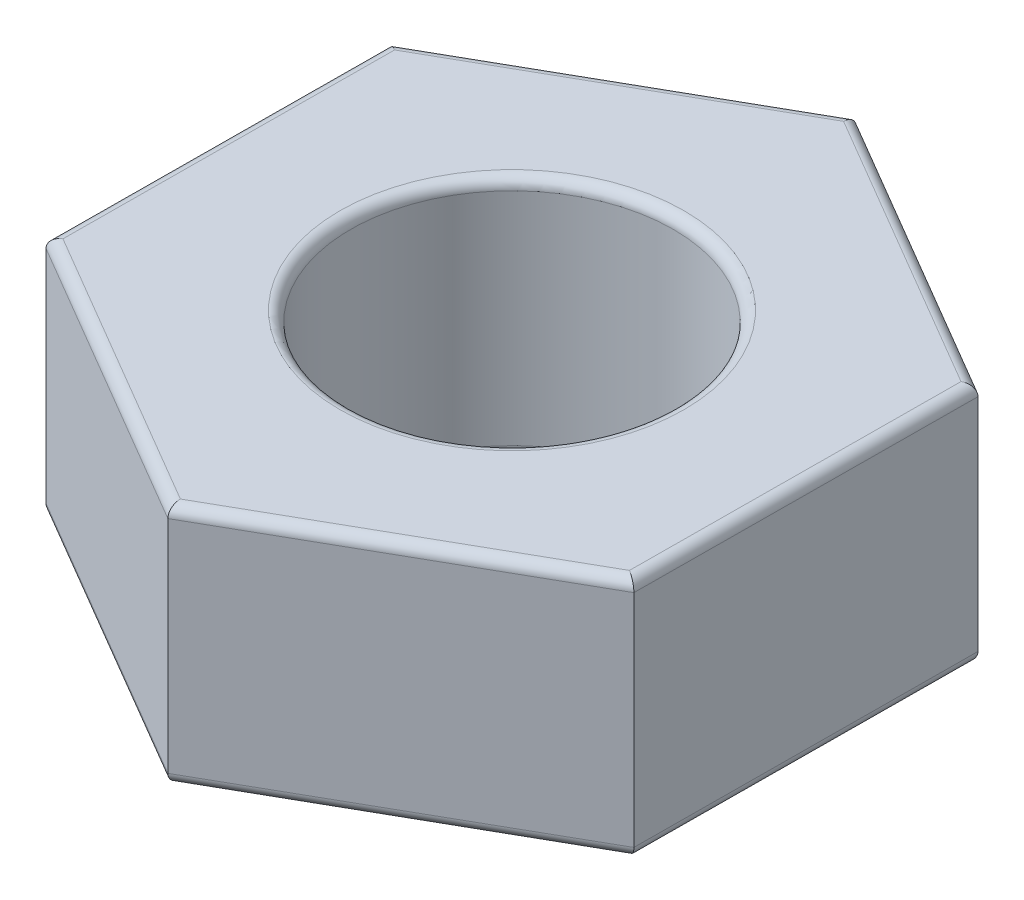
ISO-10303-21;
HEADER;
FILE_DESCRIPTION(('STEP AP214'),'2;1');
FILE_NAME('part.step','',(''),(''),'','','');
FILE_SCHEMA(('AUTOMOTIVE_DESIGN { 1 0 10303 214 1 1 1 1 }'));
ENDSEC;
DATA;
#1=APPLICATION_CONTEXT('core data for automotive mechanical design processes');
#2=APPLICATION_PROTOCOL_DEFINITION('international standard','automotive_design',2000,#1);
#3=PRODUCT_CONTEXT('',#1,'mechanical');
#4=PRODUCT('Part','Part','',(#3));
#5=PRODUCT_RELATED_PRODUCT_CATEGORY('part','',(#4));
#6=PRODUCT_DEFINITION_FORMATION('','',#4);
#7=PRODUCT_DEFINITION_CONTEXT('part definition',#1,'design');
#8=PRODUCT_DEFINITION('design','',#6,#7);
#9=PRODUCT_DEFINITION_SHAPE('','',#8);
#10=(LENGTH_UNIT() NAMED_UNIT(*) SI_UNIT(.MILLI.,.METRE.));
#11=(NAMED_UNIT(*) PLANE_ANGLE_UNIT() SI_UNIT($,.RADIAN.));
#12=(NAMED_UNIT(*) SI_UNIT($,.STERADIAN.) SOLID_ANGLE_UNIT());
#13=UNCERTAINTY_MEASURE_WITH_UNIT(LENGTH_MEASURE(1.E-05),#10,'distance_accuracy_value','');
#14=(GEOMETRIC_REPRESENTATION_CONTEXT(3) GLOBAL_UNCERTAINTY_ASSIGNED_CONTEXT((#13)) GLOBAL_UNIT_ASSIGNED_CONTEXT((#10,
#11,#12)) REPRESENTATION_CONTEXT('',''));
#15=CARTESIAN_POINT('',(0.,0.,0.));
#16=DIRECTION('',(0.,0.,1.));
#17=DIRECTION('',(1.,0.,0.));
#18=AXIS2_PLACEMENT_3D('',#15,#16,#17);
#19=CARTESIAN_POINT('',(0.,2.25,0.));
#20=DIRECTION('',(0.,1.,0.));
#21=DIRECTION('',(0.,0.,1.));
#22=AXIS2_PLACEMENT_3D('',#19,#20,#21);
#23=PLANE('',#22);
#24=CARTESIAN_POINT('',(0.,2.25,0.));
#25=DIRECTION('',(0.,1.,0.));
#26=DIRECTION('',(0.,0.,1.));
#27=AXIS2_PLACEMENT_3D('',#24,#25,#26);
#28=CIRCLE('',#27,1.6);
#29=CARTESIAN_POINT('',(0.,2.25,1.6));
#30=VERTEX_POINT('',#29);
#31=EDGE_CURVE('E11',#30,#30,#28,.F.);
#32=ORIENTED_EDGE('',*,*,#31,.T.);
#33=EDGE_LOOP('',(#32));
#34=FACE_BOUND('',#33,.T.);
#35=DIRECTION('',(-0.00688502902202696,0.,0.999976297906788));
#36=VECTOR('',#35,1.);
#37=CARTESIAN_POINT('',(-2.66086864119091,2.25,1.56943028123588));
#38=LINE('',#37,#36);
#39=CARTESIAN_POINT('',(-2.63940324505099,2.25,-1.54818727657466));
#40=VERTEX_POINT('',#39);
#41=CARTESIAN_POINT('',(-2.66047113385499,2.25,1.51169662275791));
#42=VERTEX_POINT('',#41);
#43=EDGE_CURVE('E50',#40,#42,#38,.T.);
#44=ORIENTED_EDGE('',*,*,#43,.T.);
#45=DIRECTION('',(0.862562362658581,0.,0.505950758992263));
#46=VECTOR('',#45,1.);
#47=CARTESIAN_POINT('',(0.0287321724233745,2.25,3.08909498002265));
#48=LINE('',#47,#46);
#49=CARTESIAN_POINT('',(-0.0210678888040025,2.25,3.05988389933257));
#50=VERTEX_POINT('',#49);
#51=EDGE_CURVE('E42',#42,#50,#48,.T.);
#52=ORIENTED_EDGE('',*,*,#51,.T.);
#53=DIRECTION('',(0.869447391680608,0.,-0.494025538914526));
#54=VECTOR('',#53,1.);
#55=CARTESIAN_POINT('',(2.68960081361429,2.25,1.51966469878677));
#56=LINE('',#55,#54);
#57=CARTESIAN_POINT('',(2.63940324505099,2.25,1.54818727657465));
#58=VERTEX_POINT('',#57);
#59=EDGE_CURVE('E189',#50,#58,#56,.T.);
#60=ORIENTED_EDGE('',*,*,#59,.T.);
#61=DIRECTION('',(0.00688502902202738,0.,-0.999976297906788));
#62=VECTOR('',#61,1.);
#63=CARTESIAN_POINT('',(2.66086864119091,2.25,-1.56943028123588));
#64=LINE('',#63,#62);
#65=CARTESIAN_POINT('',(2.66047113385499,2.25,-1.51169662275791));
#66=VERTEX_POINT('',#65);
#67=EDGE_CURVE('E191',#58,#66,#64,.T.);
#68=ORIENTED_EDGE('',*,*,#67,.T.);
#69=DIRECTION('',(-0.862562362658581,0.,-0.505950758992263));
#70=VECTOR('',#69,1.);
#71=CARTESIAN_POINT('',(-0.0287321724233753,2.25,-3.08909498002265));
#72=LINE('',#71,#70);
#73=CARTESIAN_POINT('',(0.0210678888040016,2.25,-3.05988389933257));
#74=VERTEX_POINT('',#73);
#75=EDGE_CURVE('E193',#66,#74,#72,.T.);
#76=ORIENTED_EDGE('',*,*,#75,.T.);
#77=DIRECTION('',(-0.869447391680608,0.,0.494025538914526));
#78=VECTOR('',#77,1.);
#79=CARTESIAN_POINT('',(-2.68960081361429,2.25,-1.51966469878677));
#80=LINE('',#79,#78);
#81=EDGE_CURVE('E55',#74,#40,#80,.T.);
#82=ORIENTED_EDGE('',*,*,#81,.T.);
#83=EDGE_LOOP('',(#44,#52,#60,#68,#76,#82));
#84=FACE_BOUND('',#83,.T.);
#85=ADVANCED_FACE('F33',(#34,#84),#23,.T.);
#86=CARTESIAN_POINT('',(0.,0.,0.));
#87=DIRECTION('',(0.,1.,0.));
#88=DIRECTION('',(0.,0.,1.));
#89=AXIS2_PLACEMENT_3D('',#86,#87,#88);
#90=PLANE('',#89);
#91=CARTESIAN_POINT('',(0.,0.,0.));
#92=DIRECTION('',(0.,1.,0.));
#93=DIRECTION('',(0.,0.,1.));
#94=AXIS2_PLACEMENT_3D('',#91,#92,#93);
#95=CIRCLE('',#94,1.6);
#96=CARTESIAN_POINT('',(0.,0.,1.6));
#97=VERTEX_POINT('',#96);
#98=EDGE_CURVE('E151',#97,#97,#95,.T.);
#99=ORIENTED_EDGE('',*,*,#98,.T.);
#100=EDGE_LOOP('',(#99));
#101=FACE_BOUND('',#100,.T.);
#102=DIRECTION('',(-0.862562362658581,0.,-0.505950758992263));
#103=VECTOR('',#102,1.);
#104=CARTESIAN_POINT('',(1.3407695113295,0.,-2.28579026104524));
#105=LINE('',#104,#103);
#106=CARTESIAN_POINT('',(0.0210678888040021,0.,-3.05988389933257));
#107=VERTEX_POINT('',#106);
#108=CARTESIAN_POINT('',(2.66047113385499,0.,-1.51169662275791));
#109=VERTEX_POINT('',#108);
#110=EDGE_CURVE('E150',#107,#109,#105,.F.);
#111=ORIENTED_EDGE('',*,*,#110,.T.);
#112=DIRECTION('',(0.00688502902202738,0.,-0.999976297906788));
#113=VECTOR('',#112,1.);
#114=CARTESIAN_POINT('',(2.64993718945299,0.,0.0182453269083725));
#115=LINE('',#114,#113);
#116=CARTESIAN_POINT('',(2.63940324505099,0.,1.54818727657465));
#117=VERTEX_POINT('',#116);
#118=EDGE_CURVE('E129',#109,#117,#115,.F.);
#119=ORIENTED_EDGE('',*,*,#118,.T.);
#120=DIRECTION('',(0.869447391680608,0.,-0.494025538914526));
#121=VECTOR('',#120,1.);
#122=CARTESIAN_POINT('',(1.30916767812349,0.,2.30403558795361));
#123=LINE('',#122,#121);
#124=CARTESIAN_POINT('',(-0.0210678888040024,0.,3.05988389933257));
#125=VERTEX_POINT('',#124);
#126=EDGE_CURVE('E139',#117,#125,#123,.F.);
#127=ORIENTED_EDGE('',*,*,#126,.T.);
#128=DIRECTION('',(0.862562362658581,0.,0.505950758992263));
#129=VECTOR('',#128,1.);
#130=CARTESIAN_POINT('',(-1.3407695113295,0.,2.28579026104524));
#131=LINE('',#130,#129);
#132=CARTESIAN_POINT('',(-2.66047113385499,0.,1.51169662275791));
#133=VERTEX_POINT('',#132);
#134=EDGE_CURVE('E145',#125,#133,#131,.F.);
#135=ORIENTED_EDGE('',*,*,#134,.T.);
#136=DIRECTION('',(-0.00688502902202696,0.,0.999976297906788));
#137=VECTOR('',#136,1.);
#138=CARTESIAN_POINT('',(-2.64993718945299,0.,-0.0182453269083715));
#139=LINE('',#138,#137);
#140=CARTESIAN_POINT('',(-2.63940324505099,0.,-1.54818727657465));
#141=VERTEX_POINT('',#140);
#142=EDGE_CURVE('E251',#133,#141,#139,.F.);
#143=ORIENTED_EDGE('',*,*,#142,.T.);
#144=DIRECTION('',(-0.869447391680608,0.,0.494025538914526));
#145=VECTOR('',#144,1.);
#146=CARTESIAN_POINT('',(-1.30916767812349,0.,-2.30403558795361));
#147=LINE('',#146,#145);
#148=EDGE_CURVE('E156',#141,#107,#147,.F.);
#149=ORIENTED_EDGE('',*,*,#148,.T.);
#150=EDGE_LOOP('',(#111,#119,#127,#135,#143,#149));
#151=FACE_BOUND('',#150,.T.);
#152=ADVANCED_FACE('F148',(#101,#151),#90,.F.);
#153=CARTESIAN_POINT('',(-0.0218629034758517,2.25,3.17535121628851));
#154=DIRECTION('',(-0.494025538914526,0.,-0.869447391680608));
#155=DIRECTION('',(-0.869447391680608,0.,0.494025538914526));
#156=AXIS2_PLACEMENT_3D('',#153,#154,#155);
#157=PLANE('',#156);
#158=DIRECTION('',(0.,-1.,0.));
#159=VECTOR('',#158,1.);
#160=CARTESIAN_POINT('',(-0.0218629034758517,2.25,3.17535121628851));
#161=LINE('',#160,#159);
#162=CARTESIAN_POINT('',(-0.0218629034758517,2.15,3.17535121628851));
#163=VERTEX_POINT('',#162);
#164=CARTESIAN_POINT('',(-0.0218629034758517,0.0999999999999998,3.17535121628851));
#165=VERTEX_POINT('',#164);
#166=EDGE_CURVE('E208',#163,#165,#161,.T.);
#167=ORIENTED_EDGE('',*,*,#166,.T.);
#168=DIRECTION('',(0.869447391680608,0.,-0.494025538914526));
#169=VECTOR('',#168,1.);
#170=CARTESIAN_POINT('',(-0.0218629034758517,0.0999999999999998,3.17535121628851));
#171=LINE('',#170,#169);
#172=CARTESIAN_POINT('',(2.73900336750574,0.0999999999999998,1.60660943795483));
#173=VERTEX_POINT('',#172);
#174=EDGE_CURVE('E187',#165,#173,#171,.T.);
#175=ORIENTED_EDGE('',*,*,#174,.T.);
#176=DIRECTION('',(0.,-1.,0.));
#177=VECTOR('',#176,1.);
#178=CARTESIAN_POINT('',(2.73900336750574,2.25,1.60660943795483));
#179=LINE('',#178,#177);
#180=CARTESIAN_POINT('',(2.73900336750574,2.15,1.60660943795483));
#181=VERTEX_POINT('',#180);
#182=EDGE_CURVE('E146',#181,#173,#179,.T.);
#183=ORIENTED_EDGE('',*,*,#182,.F.);
#184=DIRECTION('',(0.869447391680608,0.,-0.494025538914526));
#185=VECTOR('',#184,1.);
#186=CARTESIAN_POINT('',(-0.0218629034758517,2.15,3.17535121628851));
#187=LINE('',#186,#185);
#188=EDGE_CURVE('E185',#181,#163,#187,.F.);
#189=ORIENTED_EDGE('',*,*,#188,.T.);
#190=EDGE_LOOP('',(#167,#175,#183,#189));
#191=FACE_BOUND('',#190,.T.);
#192=ADVANCED_FACE('F275',(#191),#157,.F.);
#193=CARTESIAN_POINT('',(2.73900336750574,2.25,1.60660943795483));
#194=DIRECTION('',(-0.999976297906788,0.,-0.00688502902202737));
#195=DIRECTION('',(-0.00688502902202738,0.,0.999976297906788));
#196=AXIS2_PLACEMENT_3D('',#193,#194,#195);
#197=PLANE('',#196);
#198=ORIENTED_EDGE('',*,*,#182,.T.);
#199=DIRECTION('',(0.00688502902202738,0.,-0.999976297906788));
#200=VECTOR('',#199,1.);
#201=CARTESIAN_POINT('',(2.73900336750574,0.0999999999999998,1.60660943795483));
#202=LINE('',#201,#200);
#203=CARTESIAN_POINT('',(2.76086627098159,0.0999999999999998,-1.56874177833368));
#204=VERTEX_POINT('',#203);
#205=EDGE_CURVE('E132',#173,#204,#202,.T.);
#206=ORIENTED_EDGE('',*,*,#205,.T.);
#207=DIRECTION('',(0.,-1.,0.));
#208=VECTOR('',#207,1.);
#209=CARTESIAN_POINT('',(2.76086627098159,2.25,-1.56874177833368));
#210=LINE('',#209,#208);
#211=CARTESIAN_POINT('',(2.76086627098159,2.15,-1.56874177833368));
#212=VERTEX_POINT('',#211);
#213=EDGE_CURVE('E237',#212,#204,#210,.T.);
#214=ORIENTED_EDGE('',*,*,#213,.F.);
#215=DIRECTION('',(0.00688502902202738,0.,-0.999976297906788));
#216=VECTOR('',#215,1.);
#217=CARTESIAN_POINT('',(2.73900336750574,2.15,1.60660943795483));
#218=LINE('',#217,#216);
#219=EDGE_CURVE('E165',#212,#181,#218,.F.);
#220=ORIENTED_EDGE('',*,*,#219,.T.);
#221=EDGE_LOOP('',(#198,#206,#214,#220));
#222=FACE_BOUND('',#221,.T.);
#223=ADVANCED_FACE('F242',(#222),#197,.F.);
#224=CARTESIAN_POINT('',(2.76086627098159,2.25,-1.56874177833368));
#225=DIRECTION('',(-0.505950758992263,0.,0.862562362658581));
#226=DIRECTION('',(0.862562362658581,0.,0.505950758992263));
#227=AXIS2_PLACEMENT_3D('',#224,#225,#226);
#228=PLANE('',#227);
#229=ORIENTED_EDGE('',*,*,#213,.T.);
#230=DIRECTION('',(-0.862562362658581,0.,-0.505950758992263));
#231=VECTOR('',#230,1.);
#232=CARTESIAN_POINT('',(2.76086627098159,0.0999999999999998,-1.56874177833368));
#233=LINE('',#232,#231);
#234=CARTESIAN_POINT('',(0.0218629034758513,0.0999999999999998,-3.17535121628851));
#235=VERTEX_POINT('',#234);
#236=EDGE_CURVE('E170',#204,#235,#233,.T.);
#237=ORIENTED_EDGE('',*,*,#236,.T.);
#238=DIRECTION('',(0.,-1.,0.));
#239=VECTOR('',#238,1.);
#240=CARTESIAN_POINT('',(0.0218629034758513,2.25,-3.17535121628851));
#241=LINE('',#240,#239);
#242=CARTESIAN_POINT('',(0.0218629034758513,2.15,-3.17535121628851));
#243=VERTEX_POINT('',#242);
#244=EDGE_CURVE('E239',#243,#235,#241,.T.);
#245=ORIENTED_EDGE('',*,*,#244,.F.);
#246=DIRECTION('',(-0.862562362658581,0.,-0.505950758992263));
#247=VECTOR('',#246,1.);
#248=CARTESIAN_POINT('',(2.76086627098159,2.15,-1.56874177833368));
#249=LINE('',#248,#247);
#250=EDGE_CURVE('E168',#243,#212,#249,.F.);
#251=ORIENTED_EDGE('',*,*,#250,.T.);
#252=EDGE_LOOP('',(#229,#237,#245,#251));
#253=FACE_BOUND('',#252,.T.);
#254=ADVANCED_FACE('F236',(#253),#228,.F.);
#255=CARTESIAN_POINT('',(0.0218629034758513,2.25,-3.17535121628851));
#256=DIRECTION('',(0.494025538914526,0.,0.869447391680608));
#257=DIRECTION('',(0.869447391680608,0.,-0.494025538914526));
#258=AXIS2_PLACEMENT_3D('',#255,#256,#257);
#259=PLANE('',#258);
#260=ORIENTED_EDGE('',*,*,#244,.T.);
#261=DIRECTION('',(-0.869447391680608,0.,0.494025538914526));
#262=VECTOR('',#261,1.);
#263=CARTESIAN_POINT('',(0.0218629034758513,0.0999999999999998,-3.17535121628851));
#264=LINE('',#263,#262);
#265=CARTESIAN_POINT('',(-2.73900336750574,0.0999999999999998,-1.60660943795483));
#266=VERTEX_POINT('',#265);
#267=EDGE_CURVE('E174',#235,#266,#264,.T.);
#268=ORIENTED_EDGE('',*,*,#267,.T.);
#269=DIRECTION('',(0.,-1.,0.));
#270=VECTOR('',#269,1.);
#271=CARTESIAN_POINT('',(-2.73900336750574,2.25,-1.60660943795483));
#272=LINE('',#271,#270);
#273=CARTESIAN_POINT('',(-2.73900336750574,2.15,-1.60660943795483));
#274=VERTEX_POINT('',#273);
#275=EDGE_CURVE('E246',#274,#266,#272,.T.);
#276=ORIENTED_EDGE('',*,*,#275,.F.);
#277=DIRECTION('',(-0.869447391680608,0.,0.494025538914526));
#278=VECTOR('',#277,1.);
#279=CARTESIAN_POINT('',(0.0218629034758519,2.15,-3.17535121628851));
#280=LINE('',#279,#278);
#281=EDGE_CURVE('E172',#274,#243,#280,.F.);
#282=ORIENTED_EDGE('',*,*,#281,.T.);
#283=EDGE_LOOP('',(#260,#268,#276,#282));
#284=FACE_BOUND('',#283,.T.);
#285=ADVANCED_FACE('F263',(#284),#259,.F.);
#286=CARTESIAN_POINT('',(-2.73900336750574,2.25,-1.60660943795483));
#287=DIRECTION('',(0.999976297906788,0.,0.00688502902202696));
#288=DIRECTION('',(0.00688502902202696,0.,-0.999976297906788));
#289=AXIS2_PLACEMENT_3D('',#286,#287,#288);
#290=PLANE('',#289);
#291=ORIENTED_EDGE('',*,*,#275,.T.);
#292=DIRECTION('',(-0.00688502902202696,0.,0.999976297906788));
#293=VECTOR('',#292,1.);
#294=CARTESIAN_POINT('',(-2.73900336750574,0.0999999999999998,-1.60660943795483));
#295=LINE('',#294,#293);
#296=CARTESIAN_POINT('',(-2.76086627098159,0.0999999999999998,1.56874177833368));
#297=VERTEX_POINT('',#296);
#298=EDGE_CURVE('E178',#266,#297,#295,.T.);
#299=ORIENTED_EDGE('',*,*,#298,.T.);
#300=DIRECTION('',(0.,-1.,0.));
#301=VECTOR('',#300,1.);
#302=CARTESIAN_POINT('',(-2.76086627098159,2.25,1.56874177833368));
#303=LINE('',#302,#301);
#304=CARTESIAN_POINT('',(-2.76086627098159,2.15,1.56874177833368));
#305=VERTEX_POINT('',#304);
#306=EDGE_CURVE('E268',#305,#297,#303,.T.);
#307=ORIENTED_EDGE('',*,*,#306,.F.);
#308=DIRECTION('',(-0.00688502902202696,0.,0.999976297906788));
#309=VECTOR('',#308,1.);
#310=CARTESIAN_POINT('',(-2.73900336750574,2.15,-1.60660943795483));
#311=LINE('',#310,#309);
#312=EDGE_CURVE('E176',#305,#274,#311,.F.);
#313=ORIENTED_EDGE('',*,*,#312,.T.);
#314=EDGE_LOOP('',(#291,#299,#307,#313));
#315=FACE_BOUND('',#314,.T.);
#316=ADVANCED_FACE('F286',(#315),#290,.F.);
#317=CARTESIAN_POINT('',(-2.76086627098159,2.25,1.56874177833368));
#318=DIRECTION('',(0.505950758992263,0.,-0.862562362658581));
#319=DIRECTION('',(-0.862562362658581,0.,-0.505950758992263));
#320=AXIS2_PLACEMENT_3D('',#317,#318,#319);
#321=PLANE('',#320);
#322=ORIENTED_EDGE('',*,*,#306,.T.);
#323=DIRECTION('',(0.862562362658581,0.,0.505950758992263));
#324=VECTOR('',#323,1.);
#325=CARTESIAN_POINT('',(-2.76086627098159,0.0999999999999998,1.56874177833368));
#326=LINE('',#325,#324);
#327=EDGE_CURVE('E183',#297,#165,#326,.T.);
#328=ORIENTED_EDGE('',*,*,#327,.T.);
#329=ORIENTED_EDGE('',*,*,#166,.F.);
#330=DIRECTION('',(0.862562362658581,0.,0.505950758992263));
#331=VECTOR('',#330,1.);
#332=CARTESIAN_POINT('',(-2.76086627098159,2.15,1.56874177833368));
#333=LINE('',#332,#331);
#334=EDGE_CURVE('E180',#163,#305,#333,.F.);
#335=ORIENTED_EDGE('',*,*,#334,.T.);
#336=EDGE_LOOP('',(#322,#328,#329,#335));
#337=FACE_BOUND('',#336,.T.);
#338=ADVANCED_FACE('F287',(#337),#321,.F.);
#339=CARTESIAN_POINT('',(0.,2.25,0.));
#340=DIRECTION('',(0.,-1.,0.));
#341=DIRECTION('',(0.,0.,-1.));
#342=AXIS2_PLACEMENT_3D('',#339,#340,#341);
#343=CYLINDRICAL_SURFACE('',#342,1.5);
#344=CARTESIAN_POINT('',(0.,0.0999999999999998,0.));
#345=DIRECTION('',(0.,1.,0.));
#346=DIRECTION('',(0.,0.,1.));
#347=AXIS2_PLACEMENT_3D('',#344,#345,#346);
#348=CIRCLE('',#347,1.5);
#349=CARTESIAN_POINT('',(0.,0.0999999999999998,1.5));
#350=VERTEX_POINT('',#349);
#351=EDGE_CURVE('E162',#350,#350,#348,.F.);
#352=ORIENTED_EDGE('',*,*,#351,.T.);
#353=EDGE_LOOP('',(#352));
#354=FACE_BOUND('',#353,.T.);
#355=CARTESIAN_POINT('',(0.,2.15,0.));
#356=DIRECTION('',(0.,1.,0.));
#357=DIRECTION('',(0.,0.,1.));
#358=AXIS2_PLACEMENT_3D('',#355,#356,#357);
#359=CIRCLE('',#358,1.5);
#360=CARTESIAN_POINT('',(0.,2.15,1.5));
#361=VERTEX_POINT('',#360);
#362=EDGE_CURVE('E154',#361,#361,#359,.T.);
#363=ORIENTED_EDGE('',*,*,#362,.T.);
#364=EDGE_LOOP('',(#363));
#365=FACE_BOUND('',#364,.T.);
#366=ADVANCED_FACE('F306',(#354,#365),#343,.F.);
#367=CARTESIAN_POINT('',(0.,0.0999999999999998,0.));
#368=DIRECTION('',(0.,1.,0.));
#369=DIRECTION('',(0.,0.,1.));
#370=AXIS2_PLACEMENT_3D('',#367,#368,#369);
#371=TOROIDAL_SURFACE('',#370,1.6,0.1);
#372=ORIENTED_EDGE('',*,*,#351,.F.);
#373=EDGE_LOOP('',(#372));
#374=FACE_BOUND('',#373,.T.);
#375=ORIENTED_EDGE('',*,*,#98,.F.);
#376=EDGE_LOOP('',(#375));
#377=FACE_BOUND('',#376,.T.);
#378=ADVANCED_FACE('F320',(#374,#377),#371,.T.);
#379=CARTESIAN_POINT('',(-2.63900573771506,0.0999999999999998,-1.60592093505263));
#380=DIRECTION('',(-0.00688502902202696,0.,0.999976297906788));
#381=DIRECTION('',(0.999976297906788,0.,0.00688502902202696));
#382=AXIS2_PLACEMENT_3D('',#379,#380,#381);
#383=CYLINDRICAL_SURFACE('',#382,0.1);
#384=CARTESIAN_POINT('',(-2.63940324505099,0.0999999999999998,-1.54818727657465));
#385=DIRECTION('',(-0.505950758992263,0.,0.862562362658581));
#386=DIRECTION('',(0.862562362658581,0.,0.505950758992263));
#387=AXIS2_PLACEMENT_3D('',#384,#385,#386);
#388=ELLIPSE('',#387,0.115470053837925,0.1);
#389=EDGE_CURVE('E202',#141,#266,#388,.F.);
#390=ORIENTED_EDGE('',*,*,#389,.F.);
#391=ORIENTED_EDGE('',*,*,#142,.F.);
#392=CARTESIAN_POINT('',(-2.66047113385499,0.0999999999999998,1.51169662275791));
#393=DIRECTION('',(0.494025538914526,0.,0.869447391680608));
#394=DIRECTION('',(0.869447391680608,0.,-0.494025538914526));
#395=AXIS2_PLACEMENT_3D('',#392,#393,#394);
#396=ELLIPSE('',#395,0.115470053837925,0.1);
#397=EDGE_CURVE('E205',#297,#133,#396,.T.);
#398=ORIENTED_EDGE('',*,*,#397,.F.);
#399=ORIENTED_EDGE('',*,*,#298,.F.);
#400=EDGE_LOOP('',(#390,#391,#398,#399));
#401=FACE_BOUND('',#400,.T.);
#402=ADVANCED_FACE('F284',(#401),#383,.T.);
#403=CARTESIAN_POINT('',(-2.71027119508237,0.0999999999999998,1.48248554206782));
#404=DIRECTION('',(0.862562362658581,0.,0.505950758992263));
#405=DIRECTION('',(0.505950758992263,0.,-0.862562362658581));
#406=AXIS2_PLACEMENT_3D('',#403,#404,#405);
#407=CYLINDRICAL_SURFACE('',#406,0.1);
#408=ORIENTED_EDGE('',*,*,#397,.T.);
#409=ORIENTED_EDGE('',*,*,#134,.F.);
#410=CARTESIAN_POINT('',(-0.0210678888040031,0.0999999999999998,3.05988389933257));
#411=DIRECTION('',(0.999976297906788,0.,0.00688502902202708));
#412=DIRECTION('',(0.00688502902202714,0.,-0.999976297906788));
#413=AXIS2_PLACEMENT_3D('',#410,#411,#412);
#414=ELLIPSE('',#413,0.115470053837925,0.1);
#415=EDGE_CURVE('E142',#165,#125,#414,.T.);
#416=ORIENTED_EDGE('',*,*,#415,.F.);
#417=ORIENTED_EDGE('',*,*,#327,.F.);
#418=EDGE_LOOP('',(#408,#409,#416,#417));
#419=FACE_BOUND('',#418,.T.);
#420=ADVANCED_FACE('F281',(#419),#407,.T.);
#421=CARTESIAN_POINT('',(0.0712654573673039,0.0999999999999998,-3.08840647712045));
#422=DIRECTION('',(-0.869447391680608,0.,0.494025538914526));
#423=DIRECTION('',(0.494025538914526,0.,0.869447391680608));
#424=AXIS2_PLACEMENT_3D('',#421,#422,#423);
#425=CYLINDRICAL_SURFACE('',#424,0.1);
#426=ORIENTED_EDGE('',*,*,#389,.T.);
#427=ORIENTED_EDGE('',*,*,#267,.F.);
#428=CARTESIAN_POINT('',(0.0210678888040017,0.0999999999999998,-3.05988389933257));
#429=DIRECTION('',(-0.999976297906788,0.,-0.00688502902202702));
#430=DIRECTION('',(-0.00688502902202703,0.,0.999976297906788));
#431=AXIS2_PLACEMENT_3D('',#428,#429,#430);
#432=ELLIPSE('',#431,0.115470053837925,0.1);
#433=EDGE_CURVE('E135',#107,#235,#432,.F.);
#434=ORIENTED_EDGE('',*,*,#433,.F.);
#435=ORIENTED_EDGE('',*,*,#148,.F.);
#436=EDGE_LOOP('',(#426,#427,#434,#435));
#437=FACE_BOUND('',#436,.T.);
#438=ADVANCED_FACE('F258',(#437),#425,.T.);
#439=CARTESIAN_POINT('',(-0.0712654573673043,0.0999999999999998,3.08840647712045));
#440=DIRECTION('',(0.869447391680608,0.,-0.494025538914526));
#441=DIRECTION('',(-0.494025538914526,0.,-0.869447391680608));
#442=AXIS2_PLACEMENT_3D('',#439,#440,#441);
#443=CYLINDRICAL_SURFACE('',#442,0.1);
#444=ORIENTED_EDGE('',*,*,#415,.T.);
#445=ORIENTED_EDGE('',*,*,#126,.F.);
#446=CARTESIAN_POINT('',(2.63940324505099,0.0999999999999998,1.54818727657465));
#447=DIRECTION('',(0.505950758992263,0.,-0.862562362658581));
#448=DIRECTION('',(0.862562362658581,0.,0.505950758992263));
#449=AXIS2_PLACEMENT_3D('',#446,#447,#448);
#450=ELLIPSE('',#449,0.115470053837925,0.1);
#451=EDGE_CURVE('E125',#173,#117,#450,.T.);
#452=ORIENTED_EDGE('',*,*,#451,.F.);
#453=ORIENTED_EDGE('',*,*,#174,.F.);
#454=EDGE_LOOP('',(#444,#445,#452,#453));
#455=FACE_BOUND('',#454,.T.);
#456=ADVANCED_FACE('F140',(#455),#443,.T.);
#457=CARTESIAN_POINT('',(2.71027119508237,0.0999999999999998,-1.48248554206782));
#458=DIRECTION('',(-0.862562362658581,0.,-0.505950758992263));
#459=DIRECTION('',(-0.505950758992263,0.,0.862562362658581));
#460=AXIS2_PLACEMENT_3D('',#457,#458,#459);
#461=CYLINDRICAL_SURFACE('',#460,0.1);
#462=ORIENTED_EDGE('',*,*,#433,.T.);
#463=ORIENTED_EDGE('',*,*,#236,.F.);
#464=CARTESIAN_POINT('',(2.66047113385499,0.0999999999999998,-1.51169662275791));
#465=DIRECTION('',(-0.494025538914526,0.,-0.869447391680608));
#466=DIRECTION('',(-0.869447391680608,0.,0.494025538914525));
#467=AXIS2_PLACEMENT_3D('',#464,#465,#466);
#468=ELLIPSE('',#467,0.115470053837925,0.1);
#469=EDGE_CURVE('E136',#109,#204,#468,.F.);
#470=ORIENTED_EDGE('',*,*,#469,.F.);
#471=ORIENTED_EDGE('',*,*,#110,.F.);
#472=EDGE_LOOP('',(#462,#463,#470,#471));
#473=FACE_BOUND('',#472,.T.);
#474=ADVANCED_FACE('F261',(#473),#461,.T.);
#475=CARTESIAN_POINT('',(2.63900573771506,0.0999999999999998,1.60592093505263));
#476=DIRECTION('',(0.00688502902202738,0.,-0.999976297906788));
#477=DIRECTION('',(-0.999976297906788,0.,-0.00688502902202738));
#478=AXIS2_PLACEMENT_3D('',#475,#476,#477);
#479=CYLINDRICAL_SURFACE('',#478,0.1);
#480=ORIENTED_EDGE('',*,*,#451,.T.);
#481=ORIENTED_EDGE('',*,*,#118,.F.);
#482=ORIENTED_EDGE('',*,*,#469,.T.);
#483=ORIENTED_EDGE('',*,*,#205,.F.);
#484=EDGE_LOOP('',(#480,#481,#482,#483));
#485=FACE_BOUND('',#484,.T.);
#486=ADVANCED_FACE('F127',(#485),#479,.T.);
#487=CARTESIAN_POINT('',(0.,2.15,0.));
#488=DIRECTION('',(0.,1.,0.));
#489=DIRECTION('',(0.,0.,1.));
#490=AXIS2_PLACEMENT_3D('',#487,#488,#489);
#491=TOROIDAL_SURFACE('',#490,1.6,0.1);
#492=ORIENTED_EDGE('',*,*,#31,.F.);
#493=EDGE_LOOP('',(#492));
#494=FACE_BOUND('',#493,.T.);
#495=ORIENTED_EDGE('',*,*,#362,.F.);
#496=EDGE_LOOP('',(#495));
#497=FACE_BOUND('',#496,.T.);
#498=ADVANCED_FACE('F326',(#494,#497),#491,.T.);
#499=CARTESIAN_POINT('',(1.3407695113295,2.15,-2.28579026104524));
#500=DIRECTION('',(0.862562362658581,0.,0.505950758992263));
#501=DIRECTION('',(0.505950758992263,0.,-0.862562362658581));
#502=AXIS2_PLACEMENT_3D('',#499,#500,#501);
#503=CYLINDRICAL_SURFACE('',#502,0.1);
#504=CARTESIAN_POINT('',(2.66047113385499,2.15,-1.51169662275791));
#505=DIRECTION('',(0.494025538914526,0.,0.869447391680608));
#506=DIRECTION('',(-0.869447391680608,0.,0.494025538914525));
#507=AXIS2_PLACEMENT_3D('',#504,#505,#506);
#508=ELLIPSE('',#507,0.115470053837925,0.1);
#509=EDGE_CURVE('E218',#212,#66,#508,.T.);
#510=ORIENTED_EDGE('',*,*,#509,.F.);
#511=ORIENTED_EDGE('',*,*,#250,.F.);
#512=CARTESIAN_POINT('',(0.0210678888040023,2.15,-3.05988389933257));
#513=DIRECTION('',(0.999976297906788,0.,0.00688502902202702));
#514=DIRECTION('',(-0.00688502902202703,0.,0.999976297906788));
#515=AXIS2_PLACEMENT_3D('',#512,#513,#514);
#516=ELLIPSE('',#515,0.115470053837925,0.1);
#517=EDGE_CURVE('E37',#74,#243,#516,.F.);
#518=ORIENTED_EDGE('',*,*,#517,.F.);
#519=ORIENTED_EDGE('',*,*,#75,.F.);
#520=EDGE_LOOP('',(#510,#511,#518,#519));
#521=FACE_BOUND('',#520,.T.);
#522=ADVANCED_FACE('F35',(#521),#503,.T.);
#523=CARTESIAN_POINT('',(-1.30916767812349,2.15,-2.30403558795361));
#524=DIRECTION('',(0.869447391680608,0.,-0.494025538914526));
#525=DIRECTION('',(-0.494025538914526,0.,-0.869447391680608));
#526=AXIS2_PLACEMENT_3D('',#523,#524,#525);
#527=CYLINDRICAL_SURFACE('',#526,0.1);
#528=ORIENTED_EDGE('',*,*,#517,.T.);
#529=ORIENTED_EDGE('',*,*,#281,.F.);
#530=CARTESIAN_POINT('',(-2.63940324505099,2.15,-1.54818727657466));
#531=DIRECTION('',(0.505950758992263,0.,-0.862562362658581));
#532=DIRECTION('',(0.862562362658581,0.,0.505950758992263));
#533=AXIS2_PLACEMENT_3D('',#530,#531,#532);
#534=ELLIPSE('',#533,0.115470053837925,0.1);
#535=EDGE_CURVE('E216',#40,#274,#534,.F.);
#536=ORIENTED_EDGE('',*,*,#535,.F.);
#537=ORIENTED_EDGE('',*,*,#81,.F.);
#538=EDGE_LOOP('',(#528,#529,#536,#537));
#539=FACE_BOUND('',#538,.T.);
#540=ADVANCED_FACE('F228',(#539),#527,.T.);
#541=CARTESIAN_POINT('',(2.64993718945299,2.15,0.0182453269083725));
#542=DIRECTION('',(-0.00688502902202738,0.,0.999976297906788));
#543=DIRECTION('',(0.999976297906788,0.,0.00688502902202738));
#544=AXIS2_PLACEMENT_3D('',#541,#542,#543);
#545=CYLINDRICAL_SURFACE('',#544,0.1);
#546=ORIENTED_EDGE('',*,*,#509,.T.);
#547=ORIENTED_EDGE('',*,*,#67,.F.);
#548=CARTESIAN_POINT('',(2.63940324505099,2.15,1.54818727657465));
#549=DIRECTION('',(-0.505950758992263,0.,0.862562362658581));
#550=DIRECTION('',(-0.862562362658581,0.,-0.505950758992263));
#551=AXIS2_PLACEMENT_3D('',#548,#549,#550);
#552=ELLIPSE('',#551,0.115470053837925,0.1);
#553=EDGE_CURVE('E213',#181,#58,#552,.T.);
#554=ORIENTED_EDGE('',*,*,#553,.F.);
#555=ORIENTED_EDGE('',*,*,#219,.F.);
#556=EDGE_LOOP('',(#546,#547,#554,#555));
#557=FACE_BOUND('',#556,.T.);
#558=ADVANCED_FACE('F347',(#557),#545,.T.);
#559=CARTESIAN_POINT('',(-2.64993718945299,2.15,-0.0182453269083715));
#560=DIRECTION('',(0.00688502902202696,0.,-0.999976297906788));
#561=DIRECTION('',(-0.999976297906788,0.,-0.00688502902202696));
#562=AXIS2_PLACEMENT_3D('',#559,#560,#561);
#563=CYLINDRICAL_SURFACE('',#562,0.1);
#564=ORIENTED_EDGE('',*,*,#535,.T.);
#565=ORIENTED_EDGE('',*,*,#312,.F.);
#566=CARTESIAN_POINT('',(-2.66047113385499,2.15,1.51169662275791));
#567=DIRECTION('',(-0.494025538914526,0.,-0.869447391680608));
#568=DIRECTION('',(0.869447391680608,0.,-0.494025538914526));
#569=AXIS2_PLACEMENT_3D('',#566,#567,#568);
#570=ELLIPSE('',#569,0.115470053837925,0.1);
#571=EDGE_CURVE('E211',#42,#305,#570,.F.);
#572=ORIENTED_EDGE('',*,*,#571,.F.);
#573=ORIENTED_EDGE('',*,*,#43,.F.);
#574=EDGE_LOOP('',(#564,#565,#572,#573));
#575=FACE_BOUND('',#574,.T.);
#576=ADVANCED_FACE('F344',(#575),#563,.T.);
#577=CARTESIAN_POINT('',(1.30916767812349,2.15,2.30403558795361));
#578=DIRECTION('',(-0.869447391680608,0.,0.494025538914526));
#579=DIRECTION('',(0.494025538914526,0.,0.869447391680608));
#580=AXIS2_PLACEMENT_3D('',#577,#578,#579);
#581=CYLINDRICAL_SURFACE('',#580,0.1);
#582=ORIENTED_EDGE('',*,*,#553,.T.);
#583=ORIENTED_EDGE('',*,*,#59,.F.);
#584=CARTESIAN_POINT('',(-0.0210678888040038,2.15,3.05988389933257));
#585=DIRECTION('',(-0.999976297906788,0.,-0.00688502902202708));
#586=DIRECTION('',(-0.00688502902202714,0.,0.999976297906788));
#587=AXIS2_PLACEMENT_3D('',#584,#585,#586);
#588=ELLIPSE('',#587,0.115470053837925,0.1);
#589=EDGE_CURVE('E209',#163,#50,#588,.T.);
#590=ORIENTED_EDGE('',*,*,#589,.F.);
#591=ORIENTED_EDGE('',*,*,#188,.F.);
#592=EDGE_LOOP('',(#582,#583,#590,#591));
#593=FACE_BOUND('',#592,.T.);
#594=ADVANCED_FACE('F295',(#593),#581,.T.);
#595=CARTESIAN_POINT('',(-1.3407695113295,2.15,2.28579026104524));
#596=DIRECTION('',(-0.862562362658581,0.,-0.505950758992263));
#597=DIRECTION('',(-0.505950758992263,0.,0.862562362658581));
#598=AXIS2_PLACEMENT_3D('',#595,#596,#597);
#599=CYLINDRICAL_SURFACE('',#598,0.1);
#600=ORIENTED_EDGE('',*,*,#571,.T.);
#601=ORIENTED_EDGE('',*,*,#334,.F.);
#602=ORIENTED_EDGE('',*,*,#589,.T.);
#603=ORIENTED_EDGE('',*,*,#51,.F.);
#604=EDGE_LOOP('',(#600,#601,#602,#603));
#605=FACE_BOUND('',#604,.T.);
#606=ADVANCED_FACE('F290',(#605),#599,.T.);
#607=CLOSED_SHELL('',(#85,#152,#192,#223,#254,#285,#316,#338,#366,#378,#402,#420,#438,#456,#474,
#486,#498,#522,#540,#558,#576,#594,#606));
#608=MANIFOLD_SOLID_BREP('B2',#607);
#609=ADVANCED_BREP_SHAPE_REPRESENTATION('',(#18,#608),#14);
#610=SHAPE_DEFINITION_REPRESENTATION(#9,#609);
ENDSEC;
END-ISO-10303-21;
